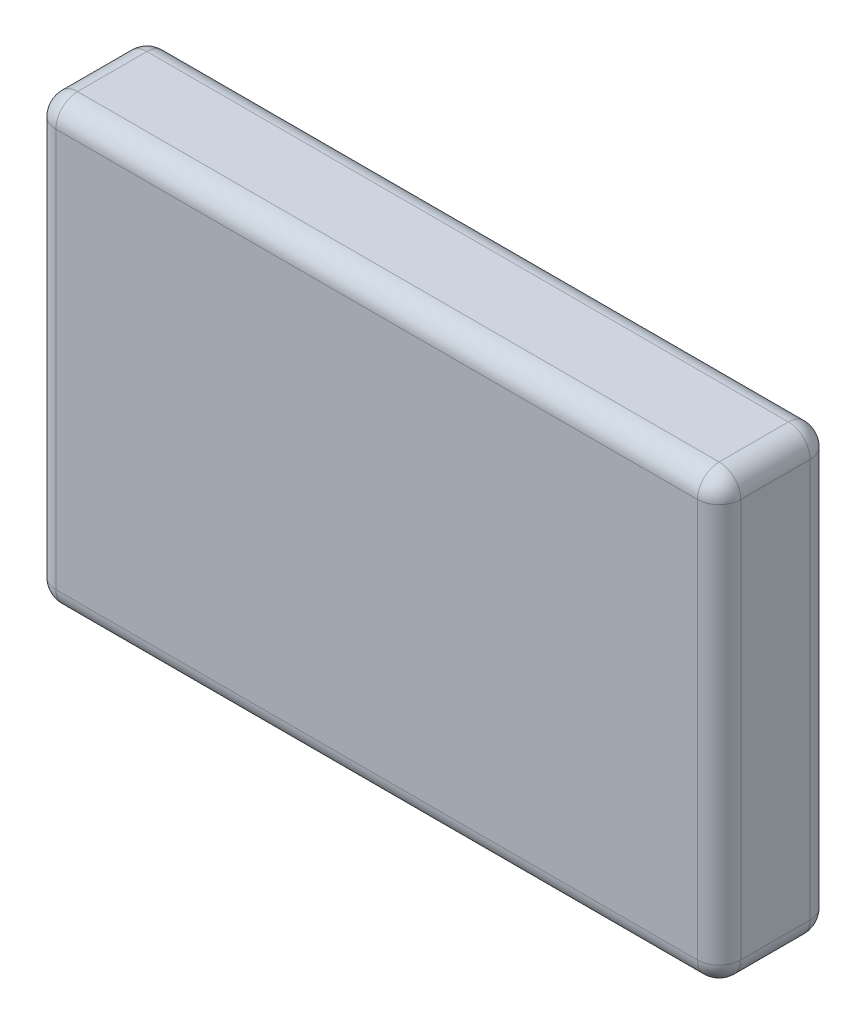
ISO-10303-21;
HEADER;
FILE_DESCRIPTION(('STEP AP214'),'2;1');
FILE_NAME('part.step','',(''),(''),'','','');
FILE_SCHEMA(('AUTOMOTIVE_DESIGN { 1 0 10303 214 1 1 1 1 }'));
ENDSEC;
DATA;
#1=APPLICATION_CONTEXT('core data for automotive mechanical design processes');
#2=APPLICATION_PROTOCOL_DEFINITION('international standard','automotive_design',2000,#1);
#3=PRODUCT_CONTEXT('',#1,'mechanical');
#4=PRODUCT('Part','Part','',(#3));
#5=PRODUCT_RELATED_PRODUCT_CATEGORY('part','',(#4));
#6=PRODUCT_DEFINITION_FORMATION('','',#4);
#7=PRODUCT_DEFINITION_CONTEXT('part definition',#1,'design');
#8=PRODUCT_DEFINITION('design','',#6,#7);
#9=PRODUCT_DEFINITION_SHAPE('','',#8);
#10=(LENGTH_UNIT() NAMED_UNIT(*) SI_UNIT(.MILLI.,.METRE.));
#11=(NAMED_UNIT(*) PLANE_ANGLE_UNIT() SI_UNIT($,.RADIAN.));
#12=(NAMED_UNIT(*) SI_UNIT($,.STERADIAN.) SOLID_ANGLE_UNIT());
#13=UNCERTAINTY_MEASURE_WITH_UNIT(LENGTH_MEASURE(1.E-05),#10,'distance_accuracy_value','');
#14=(GEOMETRIC_REPRESENTATION_CONTEXT(3) GLOBAL_UNCERTAINTY_ASSIGNED_CONTEXT((#13)) GLOBAL_UNIT_ASSIGNED_CONTEXT((#10,
#11,#12)) REPRESENTATION_CONTEXT('',''));
#15=CARTESIAN_POINT('',(0.,0.,0.));
#16=DIRECTION('',(0.,0.,1.));
#17=DIRECTION('',(1.,0.,0.));
#18=AXIS2_PLACEMENT_3D('',#15,#16,#17);
#19=CARTESIAN_POINT('',(0.,0.,26.));
#20=DIRECTION('',(-1.,0.,0.));
#21=DIRECTION('',(0.,0.,1.));
#22=AXIS2_PLACEMENT_3D('',#19,#20,#21);
#23=PLANE('',#22);
#24=DIRECTION('',(0.,1.,0.));
#25=VECTOR('',#24,1.);
#26=CARTESIAN_POINT('',(0.,0.,21.));
#27=LINE('',#26,#25);
#28=CARTESIAN_POINT('',(0.,97.,21.));
#29=VERTEX_POINT('',#28);
#30=CARTESIAN_POINT('',(0.,5.,21.));
#31=VERTEX_POINT('',#30);
#32=EDGE_CURVE('E179',#29,#31,#27,.F.);
#33=ORIENTED_EDGE('',*,*,#32,.T.);
#34=DIRECTION('',(0.,0.,-1.));
#35=VECTOR('',#34,1.);
#36=CARTESIAN_POINT('',(0.,5.,26.));
#37=LINE('',#36,#35);
#38=CARTESIAN_POINT('',(0.,5.,5.));
#39=VERTEX_POINT('',#38);
#40=EDGE_CURVE('E181',#31,#39,#37,.T.);
#41=ORIENTED_EDGE('',*,*,#40,.T.);
#42=DIRECTION('',(0.,1.,0.));
#43=VECTOR('',#42,1.);
#44=CARTESIAN_POINT('',(0.,0.,5.));
#45=LINE('',#44,#43);
#46=CARTESIAN_POINT('',(0.,97.,5.));
#47=VERTEX_POINT('',#46);
#48=EDGE_CURVE('E175',#39,#47,#45,.T.);
#49=ORIENTED_EDGE('',*,*,#48,.T.);
#50=DIRECTION('',(0.,0.,-1.));
#51=VECTOR('',#50,1.);
#52=CARTESIAN_POINT('',(0.,97.,26.));
#53=LINE('',#52,#51);
#54=EDGE_CURVE('E177',#47,#29,#53,.F.);
#55=ORIENTED_EDGE('',*,*,#54,.T.);
#56=EDGE_LOOP('',(#33,#41,#49,#55));
#57=FACE_BOUND('',#56,.T.);
#58=ADVANCED_FACE('F33',(#57),#23,.F.);
#59=CARTESIAN_POINT('',(0.,102.,26.));
#60=DIRECTION('',(0.,-1.,0.));
#61=DIRECTION('',(1.,0.,0.));
#62=AXIS2_PLACEMENT_3D('',#59,#60,#61);
#63=PLANE('',#62);
#64=DIRECTION('',(-1.,0.,0.));
#65=VECTOR('',#64,1.);
#66=CARTESIAN_POINT('',(0.,102.,5.));
#67=LINE('',#66,#65);
#68=CARTESIAN_POINT('',(-5.,102.,5.));
#69=VERTEX_POINT('',#68);
#70=CARTESIAN_POINT('',(-153.,102.,5.));
#71=VERTEX_POINT('',#70);
#72=EDGE_CURVE('E155',#69,#71,#67,.T.);
#73=ORIENTED_EDGE('',*,*,#72,.T.);
#74=DIRECTION('',(0.,0.,-1.));
#75=VECTOR('',#74,1.);
#76=CARTESIAN_POINT('',(-153.,102.,26.));
#77=LINE('',#76,#75);
#78=CARTESIAN_POINT('',(-153.,102.,21.));
#79=VERTEX_POINT('',#78);
#80=EDGE_CURVE('E128',#71,#79,#77,.F.);
#81=ORIENTED_EDGE('',*,*,#80,.T.);
#82=DIRECTION('',(-1.,0.,0.));
#83=VECTOR('',#82,1.);
#84=CARTESIAN_POINT('',(0.,102.,21.));
#85=LINE('',#84,#83);
#86=CARTESIAN_POINT('',(-5.,102.,21.));
#87=VERTEX_POINT('',#86);
#88=EDGE_CURVE('E163',#79,#87,#85,.F.);
#89=ORIENTED_EDGE('',*,*,#88,.T.);
#90=DIRECTION('',(0.,0.,-1.));
#91=VECTOR('',#90,1.);
#92=CARTESIAN_POINT('',(-5.,102.,26.));
#93=LINE('',#92,#91);
#94=EDGE_CURVE('E157',#87,#69,#93,.T.);
#95=ORIENTED_EDGE('',*,*,#94,.T.);
#96=EDGE_LOOP('',(#73,#81,#89,#95));
#97=FACE_BOUND('',#96,.T.);
#98=ADVANCED_FACE('F308',(#97),#63,.F.);
#99=CARTESIAN_POINT('',(-158.,0.,26.));
#100=DIRECTION('',(1.,0.,0.));
#101=DIRECTION('',(0.,0.,-1.));
#102=AXIS2_PLACEMENT_3D('',#99,#100,#101);
#103=PLANE('',#102);
#104=DIRECTION('',(0.,-1.,0.));
#105=VECTOR('',#104,1.);
#106=CARTESIAN_POINT('',(-158.,102.,21.));
#107=LINE('',#106,#105);
#108=CARTESIAN_POINT('',(-158.,4.99999999999997,21.));
#109=VERTEX_POINT('',#108);
#110=CARTESIAN_POINT('',(-158.,97.,21.));
#111=VERTEX_POINT('',#110);
#112=EDGE_CURVE('E153',#109,#111,#107,.F.);
#113=ORIENTED_EDGE('',*,*,#112,.T.);
#114=DIRECTION('',(0.,0.,-1.));
#115=VECTOR('',#114,1.);
#116=CARTESIAN_POINT('',(-158.,97.,26.));
#117=LINE('',#116,#115);
#118=CARTESIAN_POINT('',(-158.,97.,5.));
#119=VERTEX_POINT('',#118);
#120=EDGE_CURVE('E126',#111,#119,#117,.T.);
#121=ORIENTED_EDGE('',*,*,#120,.T.);
#122=DIRECTION('',(0.,-1.,0.));
#123=VECTOR('',#122,1.);
#124=CARTESIAN_POINT('',(-158.,0.,5.));
#125=LINE('',#124,#123);
#126=CARTESIAN_POINT('',(-158.,4.99999999999997,5.));
#127=VERTEX_POINT('',#126);
#128=EDGE_CURVE('E143',#119,#127,#125,.T.);
#129=ORIENTED_EDGE('',*,*,#128,.T.);
#130=DIRECTION('',(0.,0.,-1.));
#131=VECTOR('',#130,1.);
#132=CARTESIAN_POINT('',(-158.,4.99999999999997,26.));
#133=LINE('',#132,#131);
#134=EDGE_CURVE('E149',#127,#109,#133,.F.);
#135=ORIENTED_EDGE('',*,*,#134,.T.);
#136=EDGE_LOOP('',(#113,#121,#129,#135));
#137=FACE_BOUND('',#136,.T.);
#138=ADVANCED_FACE('F151',(#137),#103,.F.);
#139=CARTESIAN_POINT('',(0.,0.,26.));
#140=DIRECTION('',(0.,1.,0.));
#141=DIRECTION('',(-1.,0.,0.));
#142=AXIS2_PLACEMENT_3D('',#139,#140,#141);
#143=PLANE('',#142);
#144=DIRECTION('',(1.,0.,0.));
#145=VECTOR('',#144,1.);
#146=CARTESIAN_POINT('',(0.,0.,5.));
#147=LINE('',#146,#145);
#148=CARTESIAN_POINT('',(-153.,0.,5.));
#149=VERTEX_POINT('',#148);
#150=CARTESIAN_POINT('',(-5.,0.,5.));
#151=VERTEX_POINT('',#150);
#152=EDGE_CURVE('E184',#149,#151,#147,.T.);
#153=ORIENTED_EDGE('',*,*,#152,.T.);
#154=DIRECTION('',(0.,0.,-1.));
#155=VECTOR('',#154,1.);
#156=CARTESIAN_POINT('',(-5.,0.,26.));
#157=LINE('',#156,#155);
#158=CARTESIAN_POINT('',(-5.,0.,21.));
#159=VERTEX_POINT('',#158);
#160=EDGE_CURVE('E190',#151,#159,#157,.F.);
#161=ORIENTED_EDGE('',*,*,#160,.T.);
#162=DIRECTION('',(1.,0.,0.));
#163=VECTOR('',#162,1.);
#164=CARTESIAN_POINT('',(-158.,0.,21.));
#165=LINE('',#164,#163);
#166=CARTESIAN_POINT('',(-153.,0.,21.));
#167=VERTEX_POINT('',#166);
#168=EDGE_CURVE('E188',#159,#167,#165,.F.);
#169=ORIENTED_EDGE('',*,*,#168,.T.);
#170=DIRECTION('',(0.,0.,-1.));
#171=VECTOR('',#170,1.);
#172=CARTESIAN_POINT('',(-153.,0.,26.));
#173=LINE('',#172,#171);
#174=EDGE_CURVE('E186',#167,#149,#173,.T.);
#175=ORIENTED_EDGE('',*,*,#174,.T.);
#176=EDGE_LOOP('',(#153,#161,#169,#175));
#177=FACE_BOUND('',#176,.T.);
#178=ADVANCED_FACE('F280',(#177),#143,.F.);
#179=CARTESIAN_POINT('',(0.,0.,26.));
#180=DIRECTION('',(0.,0.,1.));
#181=DIRECTION('',(1.,0.,0.));
#182=AXIS2_PLACEMENT_3D('',#179,#180,#181);
#183=PLANE('',#182);
#184=DIRECTION('',(0.,1.,0.));
#185=VECTOR('',#184,1.);
#186=CARTESIAN_POINT('',(-5.,102.,26.));
#187=LINE('',#186,#185);
#188=CARTESIAN_POINT('',(-5.,5.,26.));
#189=VERTEX_POINT('',#188);
#190=CARTESIAN_POINT('',(-5.,97.,26.));
#191=VERTEX_POINT('',#190);
#192=EDGE_CURVE('E170',#189,#191,#187,.T.);
#193=ORIENTED_EDGE('',*,*,#192,.T.);
#194=DIRECTION('',(-1.,0.,0.));
#195=VECTOR('',#194,1.);
#196=CARTESIAN_POINT('',(-158.,97.,26.));
#197=LINE('',#196,#195);
#198=CARTESIAN_POINT('',(-153.,97.,26.));
#199=VERTEX_POINT('',#198);
#200=EDGE_CURVE('E172',#191,#199,#197,.T.);
#201=ORIENTED_EDGE('',*,*,#200,.T.);
#202=DIRECTION('',(0.,-1.,0.));
#203=VECTOR('',#202,1.);
#204=CARTESIAN_POINT('',(-153.,0.,26.));
#205=LINE('',#204,#203);
#206=CARTESIAN_POINT('',(-153.,4.99999999999997,26.));
#207=VERTEX_POINT('',#206);
#208=EDGE_CURVE('E168',#199,#207,#205,.T.);
#209=ORIENTED_EDGE('',*,*,#208,.T.);
#210=DIRECTION('',(1.,0.,0.));
#211=VECTOR('',#210,1.);
#212=CARTESIAN_POINT('',(0.,5.,26.));
#213=LINE('',#212,#211);
#214=EDGE_CURVE('E166',#207,#189,#213,.T.);
#215=ORIENTED_EDGE('',*,*,#214,.T.);
#216=EDGE_LOOP('',(#193,#201,#209,#215));
#217=FACE_BOUND('',#216,.T.);
#218=ADVANCED_FACE('F271',(#217),#183,.T.);
#219=CARTESIAN_POINT('',(0.,0.,0.));
#220=DIRECTION('',(0.,0.,1.));
#221=DIRECTION('',(1.,0.,0.));
#222=AXIS2_PLACEMENT_3D('',#219,#220,#221);
#223=PLANE('',#222);
#224=DIRECTION('',(-1.,0.,0.));
#225=VECTOR('',#224,1.);
#226=CARTESIAN_POINT('',(0.,97.,0.));
#227=LINE('',#226,#225);
#228=CARTESIAN_POINT('',(-153.,97.,0.));
#229=VERTEX_POINT('',#228);
#230=CARTESIAN_POINT('',(-5.,97.,0.));
#231=VERTEX_POINT('',#230);
#232=EDGE_CURVE('E42',#229,#231,#227,.F.);
#233=ORIENTED_EDGE('',*,*,#232,.T.);
#234=DIRECTION('',(0.,1.,0.));
#235=VECTOR('',#234,1.);
#236=CARTESIAN_POINT('',(-5.,0.,0.));
#237=LINE('',#236,#235);
#238=CARTESIAN_POINT('',(-5.,5.,0.));
#239=VERTEX_POINT('',#238);
#240=EDGE_CURVE('E11',#231,#239,#237,.F.);
#241=ORIENTED_EDGE('',*,*,#240,.T.);
#242=DIRECTION('',(1.,0.,0.));
#243=VECTOR('',#242,1.);
#244=CARTESIAN_POINT('',(0.,5.,0.));
#245=LINE('',#244,#243);
#246=CARTESIAN_POINT('',(-153.,4.99999999999997,0.));
#247=VERTEX_POINT('',#246);
#248=EDGE_CURVE('E193',#239,#247,#245,.F.);
#249=ORIENTED_EDGE('',*,*,#248,.T.);
#250=DIRECTION('',(0.,-1.,0.));
#251=VECTOR('',#250,1.);
#252=CARTESIAN_POINT('',(-153.,0.,0.));
#253=LINE('',#252,#251);
#254=EDGE_CURVE('E53',#247,#229,#253,.F.);
#255=ORIENTED_EDGE('',*,*,#254,.T.);
#256=EDGE_LOOP('',(#233,#241,#249,#255));
#257=FACE_BOUND('',#256,.T.);
#258=ADVANCED_FACE('F478',(#257),#223,.F.);
#259=CARTESIAN_POINT('',(-5.,5.,26.));
#260=DIRECTION('',(0.,0.,-1.));
#261=DIRECTION('',(-1.,0.,0.));
#262=AXIS2_PLACEMENT_3D('',#259,#260,#261);
#263=CYLINDRICAL_SURFACE('',#262,5.);
#264=CARTESIAN_POINT('',(-5.,5.,21.));
#265=DIRECTION('',(0.,0.,1.));
#266=DIRECTION('',(1.,0.,0.));
#267=AXIS2_PLACEMENT_3D('',#264,#265,#266);
#268=CIRCLE('',#267,5.);
#269=EDGE_CURVE('E37',#159,#31,#268,.T.);
#270=ORIENTED_EDGE('',*,*,#269,.F.);
#271=ORIENTED_EDGE('',*,*,#160,.F.);
#272=CARTESIAN_POINT('',(-5.,5.,5.));
#273=DIRECTION('',(0.,0.,-1.));
#274=DIRECTION('',(-1.,0.,0.));
#275=AXIS2_PLACEMENT_3D('',#272,#273,#274);
#276=CIRCLE('',#275,5.);
#277=EDGE_CURVE('E248',#39,#151,#276,.T.);
#278=ORIENTED_EDGE('',*,*,#277,.F.);
#279=ORIENTED_EDGE('',*,*,#40,.F.);
#280=EDGE_LOOP('',(#270,#271,#278,#279));
#281=FACE_BOUND('',#280,.T.);
#282=ADVANCED_FACE('F35',(#281),#263,.T.);
#283=CARTESIAN_POINT('',(-5.,5.,21.));
#284=DIRECTION('',(0.,0.,1.));
#285=DIRECTION('',(1.,0.,0.));
#286=AXIS2_PLACEMENT_3D('',#283,#284,#285);
#287=SPHERICAL_SURFACE('',#286,5.);
#288=CARTESIAN_POINT('',(-5.,5.,21.));
#289=DIRECTION('',(1.,0.,0.));
#290=DIRECTION('',(0.,1.,0.));
#291=AXIS2_PLACEMENT_3D('',#288,#289,#290);
#292=CIRCLE('',#291,5.);
#293=EDGE_CURVE('E243',#159,#189,#292,.F.);
#294=ORIENTED_EDGE('',*,*,#293,.F.);
#295=ORIENTED_EDGE('',*,*,#269,.T.);
#296=CARTESIAN_POINT('',(-5.,5.,21.));
#297=DIRECTION('',(0.,-1.,0.));
#298=DIRECTION('',(0.,0.,-1.));
#299=AXIS2_PLACEMENT_3D('',#296,#297,#298);
#300=CIRCLE('',#299,5.);
#301=EDGE_CURVE('E246',#189,#31,#300,.F.);
#302=ORIENTED_EDGE('',*,*,#301,.F.);
#303=EDGE_LOOP('',(#294,#295,#302));
#304=FACE_BOUND('',#303,.T.);
#305=ADVANCED_FACE('F259',(#304),#287,.T.);
#306=CARTESIAN_POINT('',(-5.,5.,5.));
#307=DIRECTION('',(0.,0.,1.));
#308=DIRECTION('',(1.,0.,0.));
#309=AXIS2_PLACEMENT_3D('',#306,#307,#308);
#310=SPHERICAL_SURFACE('',#309,5.);
#311=CARTESIAN_POINT('',(-5.,5.,5.));
#312=DIRECTION('',(0.,-1.,0.));
#313=DIRECTION('',(1.,0.,0.));
#314=AXIS2_PLACEMENT_3D('',#311,#312,#313);
#315=CIRCLE('',#314,5.);
#316=EDGE_CURVE('E237',#39,#239,#315,.F.);
#317=ORIENTED_EDGE('',*,*,#316,.F.);
#318=ORIENTED_EDGE('',*,*,#277,.T.);
#319=CARTESIAN_POINT('',(-5.,5.,5.));
#320=DIRECTION('',(1.,0.,0.));
#321=DIRECTION('',(0.,1.,0.));
#322=AXIS2_PLACEMENT_3D('',#319,#320,#321);
#323=CIRCLE('',#322,5.);
#324=EDGE_CURVE('E240',#239,#151,#323,.F.);
#325=ORIENTED_EDGE('',*,*,#324,.F.);
#326=EDGE_LOOP('',(#317,#318,#325));
#327=FACE_BOUND('',#326,.T.);
#328=ADVANCED_FACE('F457',(#327),#310,.T.);
#329=CARTESIAN_POINT('',(-5.,0.,21.));
#330=DIRECTION('',(0.,-1.,0.));
#331=DIRECTION('',(0.,0.,-1.));
#332=AXIS2_PLACEMENT_3D('',#329,#330,#331);
#333=CYLINDRICAL_SURFACE('',#332,5.);
#334=ORIENTED_EDGE('',*,*,#301,.T.);
#335=ORIENTED_EDGE('',*,*,#32,.F.);
#336=CARTESIAN_POINT('',(-5.,97.,21.));
#337=DIRECTION('',(0.,1.,0.));
#338=DIRECTION('',(0.,0.,1.));
#339=AXIS2_PLACEMENT_3D('',#336,#337,#338);
#340=CIRCLE('',#339,5.);
#341=EDGE_CURVE('E231',#191,#29,#340,.T.);
#342=ORIENTED_EDGE('',*,*,#341,.F.);
#343=ORIENTED_EDGE('',*,*,#192,.F.);
#344=EDGE_LOOP('',(#334,#335,#342,#343));
#345=FACE_BOUND('',#344,.T.);
#346=ADVANCED_FACE('F266',(#345),#333,.T.);
#347=CARTESIAN_POINT('',(0.,5.,21.));
#348=DIRECTION('',(-1.,0.,0.));
#349=DIRECTION('',(0.,-1.,0.));
#350=AXIS2_PLACEMENT_3D('',#347,#348,#349);
#351=CYLINDRICAL_SURFACE('',#350,5.);
#352=ORIENTED_EDGE('',*,*,#293,.T.);
#353=ORIENTED_EDGE('',*,*,#214,.F.);
#354=CARTESIAN_POINT('',(-153.,4.99999999999997,21.));
#355=DIRECTION('',(-1.,0.,0.));
#356=DIRECTION('',(0.,0.,1.));
#357=AXIS2_PLACEMENT_3D('',#354,#355,#356);
#358=CIRCLE('',#357,5.);
#359=EDGE_CURVE('E228',#167,#207,#358,.T.);
#360=ORIENTED_EDGE('',*,*,#359,.F.);
#361=ORIENTED_EDGE('',*,*,#168,.F.);
#362=EDGE_LOOP('',(#352,#353,#360,#361));
#363=FACE_BOUND('',#362,.T.);
#364=ADVANCED_FACE('F277',(#363),#351,.T.);
#365=CARTESIAN_POINT('',(-153.,4.99999999999997,26.));
#366=DIRECTION('',(0.,0.,-1.));
#367=DIRECTION('',(-1.,0.,0.));
#368=AXIS2_PLACEMENT_3D('',#365,#366,#367);
#369=CYLINDRICAL_SURFACE('',#368,5.);
#370=CARTESIAN_POINT('',(-153.,4.99999999999997,5.));
#371=DIRECTION('',(0.,0.,-1.));
#372=DIRECTION('',(-1.,0.,0.));
#373=AXIS2_PLACEMENT_3D('',#370,#371,#372);
#374=CIRCLE('',#373,5.);
#375=EDGE_CURVE('E222',#149,#127,#374,.T.);
#376=ORIENTED_EDGE('',*,*,#375,.F.);
#377=ORIENTED_EDGE('',*,*,#174,.F.);
#378=CARTESIAN_POINT('',(-153.,4.99999999999997,21.));
#379=DIRECTION('',(0.,0.,1.));
#380=DIRECTION('',(1.,0.,0.));
#381=AXIS2_PLACEMENT_3D('',#378,#379,#380);
#382=CIRCLE('',#381,5.);
#383=EDGE_CURVE('E225',#109,#167,#382,.T.);
#384=ORIENTED_EDGE('',*,*,#383,.F.);
#385=ORIENTED_EDGE('',*,*,#134,.F.);
#386=EDGE_LOOP('',(#376,#377,#384,#385));
#387=FACE_BOUND('',#386,.T.);
#388=ADVANCED_FACE('F285',(#387),#369,.T.);
#389=CARTESIAN_POINT('',(0.,5.,5.));
#390=DIRECTION('',(1.,0.,0.));
#391=DIRECTION('',(0.,1.,0.));
#392=AXIS2_PLACEMENT_3D('',#389,#390,#391);
#393=CYLINDRICAL_SURFACE('',#392,5.);
#394=ORIENTED_EDGE('',*,*,#324,.T.);
#395=ORIENTED_EDGE('',*,*,#152,.F.);
#396=CARTESIAN_POINT('',(-153.,4.99999999999997,5.));
#397=DIRECTION('',(-1.,0.,0.));
#398=DIRECTION('',(0.,-1.,0.));
#399=AXIS2_PLACEMENT_3D('',#396,#397,#398);
#400=CIRCLE('',#399,5.);
#401=EDGE_CURVE('E219',#247,#149,#400,.T.);
#402=ORIENTED_EDGE('',*,*,#401,.F.);
#403=ORIENTED_EDGE('',*,*,#248,.F.);
#404=EDGE_LOOP('',(#394,#395,#402,#403));
#405=FACE_BOUND('',#404,.T.);
#406=ADVANCED_FACE('F291',(#405),#393,.T.);
#407=CARTESIAN_POINT('',(-5.,0.,5.));
#408=DIRECTION('',(0.,1.,0.));
#409=DIRECTION('',(0.,0.,1.));
#410=AXIS2_PLACEMENT_3D('',#407,#408,#409);
#411=CYLINDRICAL_SURFACE('',#410,5.);
#412=ORIENTED_EDGE('',*,*,#316,.T.);
#413=ORIENTED_EDGE('',*,*,#240,.F.);
#414=CARTESIAN_POINT('',(-5.,97.,5.));
#415=DIRECTION('',(0.,1.,0.));
#416=DIRECTION('',(0.,0.,1.));
#417=AXIS2_PLACEMENT_3D('',#414,#415,#416);
#418=CIRCLE('',#417,5.);
#419=EDGE_CURVE('E216',#47,#231,#418,.T.);
#420=ORIENTED_EDGE('',*,*,#419,.F.);
#421=ORIENTED_EDGE('',*,*,#48,.F.);
#422=EDGE_LOOP('',(#412,#413,#420,#421));
#423=FACE_BOUND('',#422,.T.);
#424=ADVANCED_FACE('F301',(#423),#411,.T.);
#425=CARTESIAN_POINT('',(-5.,97.,26.));
#426=DIRECTION('',(0.,0.,-1.));
#427=DIRECTION('',(-1.,0.,0.));
#428=AXIS2_PLACEMENT_3D('',#425,#426,#427);
#429=CYLINDRICAL_SURFACE('',#428,5.);
#430=CARTESIAN_POINT('',(-5.,97.,21.));
#431=DIRECTION('',(0.,0.,1.));
#432=DIRECTION('',(1.,0.,0.));
#433=AXIS2_PLACEMENT_3D('',#430,#431,#432);
#434=CIRCLE('',#433,5.);
#435=EDGE_CURVE('E234',#29,#87,#434,.T.);
#436=ORIENTED_EDGE('',*,*,#435,.F.);
#437=ORIENTED_EDGE('',*,*,#54,.F.);
#438=CARTESIAN_POINT('',(-5.,97.,5.));
#439=DIRECTION('',(0.,0.,-1.));
#440=DIRECTION('',(-1.,0.,0.));
#441=AXIS2_PLACEMENT_3D('',#438,#439,#440);
#442=CIRCLE('',#441,5.);
#443=EDGE_CURVE('E213',#69,#47,#442,.T.);
#444=ORIENTED_EDGE('',*,*,#443,.F.);
#445=ORIENTED_EDGE('',*,*,#94,.F.);
#446=EDGE_LOOP('',(#436,#437,#444,#445));
#447=FACE_BOUND('',#446,.T.);
#448=ADVANCED_FACE('F297',(#447),#429,.T.);
#449=CARTESIAN_POINT('',(-5.,97.,21.));
#450=DIRECTION('',(0.,0.,1.));
#451=DIRECTION('',(1.,0.,0.));
#452=AXIS2_PLACEMENT_3D('',#449,#450,#451);
#453=SPHERICAL_SURFACE('',#452,5.);
#454=ORIENTED_EDGE('',*,*,#341,.T.);
#455=ORIENTED_EDGE('',*,*,#435,.T.);
#456=CARTESIAN_POINT('',(-5.,97.,21.));
#457=DIRECTION('',(1.,0.,0.));
#458=DIRECTION('',(0.,0.,-1.));
#459=AXIS2_PLACEMENT_3D('',#456,#457,#458);
#460=CIRCLE('',#459,5.);
#461=EDGE_CURVE('E210',#191,#87,#460,.F.);
#462=ORIENTED_EDGE('',*,*,#461,.F.);
#463=EDGE_LOOP('',(#454,#455,#462));
#464=FACE_BOUND('',#463,.T.);
#465=ADVANCED_FACE('F311',(#464),#453,.T.);
#466=CARTESIAN_POINT('',(-153.,4.99999999999997,21.));
#467=DIRECTION('',(0.,0.,1.));
#468=DIRECTION('',(1.,0.,0.));
#469=AXIS2_PLACEMENT_3D('',#466,#467,#468);
#470=SPHERICAL_SURFACE('',#469,5.);
#471=ORIENTED_EDGE('',*,*,#383,.T.);
#472=ORIENTED_EDGE('',*,*,#359,.T.);
#473=CARTESIAN_POINT('',(-153.,4.99999999999997,21.));
#474=DIRECTION('',(0.,-1.,0.));
#475=DIRECTION('',(0.,0.,-1.));
#476=AXIS2_PLACEMENT_3D('',#473,#474,#475);
#477=CIRCLE('',#476,5.);
#478=EDGE_CURVE('E207',#109,#207,#477,.F.);
#479=ORIENTED_EDGE('',*,*,#478,.F.);
#480=EDGE_LOOP('',(#471,#472,#479));
#481=FACE_BOUND('',#480,.T.);
#482=ADVANCED_FACE('F320',(#481),#470,.T.);
#483=CARTESIAN_POINT('',(-153.,4.99999999999997,5.));
#484=DIRECTION('',(0.,0.,1.));
#485=DIRECTION('',(1.,0.,0.));
#486=AXIS2_PLACEMENT_3D('',#483,#484,#485);
#487=SPHERICAL_SURFACE('',#486,5.);
#488=ORIENTED_EDGE('',*,*,#401,.T.);
#489=ORIENTED_EDGE('',*,*,#375,.T.);
#490=CARTESIAN_POINT('',(-153.,4.99999999999997,5.));
#491=DIRECTION('',(0.,-1.,0.));
#492=DIRECTION('',(0.,0.,-1.));
#493=AXIS2_PLACEMENT_3D('',#490,#491,#492);
#494=CIRCLE('',#493,5.);
#495=EDGE_CURVE('E146',#247,#127,#494,.F.);
#496=ORIENTED_EDGE('',*,*,#495,.F.);
#497=EDGE_LOOP('',(#488,#489,#496));
#498=FACE_BOUND('',#497,.T.);
#499=ADVANCED_FACE('F289',(#498),#487,.T.);
#500=CARTESIAN_POINT('',(-5.,97.,5.));
#501=DIRECTION('',(0.,0.,1.));
#502=DIRECTION('',(1.,0.,0.));
#503=AXIS2_PLACEMENT_3D('',#500,#501,#502);
#504=SPHERICAL_SURFACE('',#503,5.);
#505=ORIENTED_EDGE('',*,*,#443,.T.);
#506=ORIENTED_EDGE('',*,*,#419,.T.);
#507=CARTESIAN_POINT('',(-5.,97.,5.));
#508=DIRECTION('',(1.,0.,0.));
#509=DIRECTION('',(0.,0.,-1.));
#510=AXIS2_PLACEMENT_3D('',#507,#508,#509);
#511=CIRCLE('',#510,5.);
#512=EDGE_CURVE('E203',#69,#231,#511,.F.);
#513=ORIENTED_EDGE('',*,*,#512,.F.);
#514=EDGE_LOOP('',(#505,#506,#513));
#515=FACE_BOUND('',#514,.T.);
#516=ADVANCED_FACE('F303',(#515),#504,.T.);
#517=CARTESIAN_POINT('',(0.,97.,21.));
#518=DIRECTION('',(1.,0.,0.));
#519=DIRECTION('',(0.,1.,0.));
#520=AXIS2_PLACEMENT_3D('',#517,#518,#519);
#521=CYLINDRICAL_SURFACE('',#520,5.);
#522=ORIENTED_EDGE('',*,*,#461,.T.);
#523=ORIENTED_EDGE('',*,*,#88,.F.);
#524=CARTESIAN_POINT('',(-153.,97.,21.));
#525=DIRECTION('',(-1.,0.,0.));
#526=DIRECTION('',(0.,0.,1.));
#527=AXIS2_PLACEMENT_3D('',#524,#525,#526);
#528=CIRCLE('',#527,5.);
#529=EDGE_CURVE('E200',#199,#79,#528,.T.);
#530=ORIENTED_EDGE('',*,*,#529,.F.);
#531=ORIENTED_EDGE('',*,*,#200,.F.);
#532=EDGE_LOOP('',(#522,#523,#530,#531));
#533=FACE_BOUND('',#532,.T.);
#534=ADVANCED_FACE('F313',(#533),#521,.T.);
#535=CARTESIAN_POINT('',(-153.,0.,21.));
#536=DIRECTION('',(0.,1.,0.));
#537=DIRECTION('',(0.,0.,1.));
#538=AXIS2_PLACEMENT_3D('',#535,#536,#537);
#539=CYLINDRICAL_SURFACE('',#538,5.);
#540=ORIENTED_EDGE('',*,*,#478,.T.);
#541=ORIENTED_EDGE('',*,*,#208,.F.);
#542=CARTESIAN_POINT('',(-153.,97.,21.));
#543=DIRECTION('',(0.,1.,0.));
#544=DIRECTION('',(0.,0.,1.));
#545=AXIS2_PLACEMENT_3D('',#542,#543,#544);
#546=CIRCLE('',#545,5.);
#547=EDGE_CURVE('E140',#111,#199,#546,.T.);
#548=ORIENTED_EDGE('',*,*,#547,.F.);
#549=ORIENTED_EDGE('',*,*,#112,.F.);
#550=EDGE_LOOP('',(#540,#541,#548,#549));
#551=FACE_BOUND('',#550,.T.);
#552=ADVANCED_FACE('F318',(#551),#539,.T.);
#553=CARTESIAN_POINT('',(-153.,0.,5.));
#554=DIRECTION('',(0.,-1.,0.));
#555=DIRECTION('',(0.,0.,-1.));
#556=AXIS2_PLACEMENT_3D('',#553,#554,#555);
#557=CYLINDRICAL_SURFACE('',#556,5.);
#558=ORIENTED_EDGE('',*,*,#495,.T.);
#559=ORIENTED_EDGE('',*,*,#128,.F.);
#560=CARTESIAN_POINT('',(-153.,97.,5.));
#561=DIRECTION('',(0.,1.,0.));
#562=DIRECTION('',(0.,0.,1.));
#563=AXIS2_PLACEMENT_3D('',#560,#561,#562);
#564=CIRCLE('',#563,5.);
#565=EDGE_CURVE('E134',#229,#119,#564,.T.);
#566=ORIENTED_EDGE('',*,*,#565,.F.);
#567=ORIENTED_EDGE('',*,*,#254,.F.);
#568=EDGE_LOOP('',(#558,#559,#566,#567));
#569=FACE_BOUND('',#568,.T.);
#570=ADVANCED_FACE('F144',(#569),#557,.T.);
#571=CARTESIAN_POINT('',(0.,97.,5.));
#572=DIRECTION('',(-1.,0.,0.));
#573=DIRECTION('',(0.,-1.,0.));
#574=AXIS2_PLACEMENT_3D('',#571,#572,#573);
#575=CYLINDRICAL_SURFACE('',#574,5.);
#576=ORIENTED_EDGE('',*,*,#512,.T.);
#577=ORIENTED_EDGE('',*,*,#232,.F.);
#578=CARTESIAN_POINT('',(-153.,97.,5.));
#579=DIRECTION('',(-1.,0.,0.));
#580=DIRECTION('',(0.,0.,1.));
#581=AXIS2_PLACEMENT_3D('',#578,#579,#580);
#582=CIRCLE('',#581,5.);
#583=EDGE_CURVE('E138',#71,#229,#582,.T.);
#584=ORIENTED_EDGE('',*,*,#583,.F.);
#585=ORIENTED_EDGE('',*,*,#72,.F.);
#586=EDGE_LOOP('',(#576,#577,#584,#585));
#587=FACE_BOUND('',#586,.T.);
#588=ADVANCED_FACE('F306',(#587),#575,.T.);
#589=CARTESIAN_POINT('',(-153.,97.,21.));
#590=DIRECTION('',(0.,0.,1.));
#591=DIRECTION('',(1.,0.,0.));
#592=AXIS2_PLACEMENT_3D('',#589,#590,#591);
#593=SPHERICAL_SURFACE('',#592,5.);
#594=ORIENTED_EDGE('',*,*,#547,.T.);
#595=ORIENTED_EDGE('',*,*,#529,.T.);
#596=CARTESIAN_POINT('',(-153.,97.,21.));
#597=DIRECTION('',(0.,0.,1.));
#598=DIRECTION('',(1.,0.,0.));
#599=AXIS2_PLACEMENT_3D('',#596,#597,#598);
#600=CIRCLE('',#599,5.);
#601=EDGE_CURVE('E131',#111,#79,#600,.F.);
#602=ORIENTED_EDGE('',*,*,#601,.F.);
#603=EDGE_LOOP('',(#594,#595,#602));
#604=FACE_BOUND('',#603,.T.);
#605=ADVANCED_FACE('F341',(#604),#593,.T.);
#606=CARTESIAN_POINT('',(-153.,97.,5.));
#607=DIRECTION('',(0.,0.,1.));
#608=DIRECTION('',(1.,0.,0.));
#609=AXIS2_PLACEMENT_3D('',#606,#607,#608);
#610=SPHERICAL_SURFACE('',#609,5.);
#611=ORIENTED_EDGE('',*,*,#583,.T.);
#612=ORIENTED_EDGE('',*,*,#565,.T.);
#613=CARTESIAN_POINT('',(-153.,97.,5.));
#614=DIRECTION('',(0.,0.,-1.));
#615=DIRECTION('',(-1.,0.,0.));
#616=AXIS2_PLACEMENT_3D('',#613,#614,#615);
#617=CIRCLE('',#616,5.);
#618=EDGE_CURVE('E122',#71,#119,#617,.F.);
#619=ORIENTED_EDGE('',*,*,#618,.F.);
#620=EDGE_LOOP('',(#611,#612,#619));
#621=FACE_BOUND('',#620,.T.);
#622=ADVANCED_FACE('F136',(#621),#610,.T.);
#623=CARTESIAN_POINT('',(-153.,97.,26.));
#624=DIRECTION('',(0.,0.,-1.));
#625=DIRECTION('',(-1.,0.,0.));
#626=AXIS2_PLACEMENT_3D('',#623,#624,#625);
#627=CYLINDRICAL_SURFACE('',#626,5.);
#628=ORIENTED_EDGE('',*,*,#601,.T.);
#629=ORIENTED_EDGE('',*,*,#80,.F.);
#630=ORIENTED_EDGE('',*,*,#618,.T.);
#631=ORIENTED_EDGE('',*,*,#120,.F.);
#632=EDGE_LOOP('',(#628,#629,#630,#631));
#633=FACE_BOUND('',#632,.T.);
#634=ADVANCED_FACE('F124',(#633),#627,.T.);
#635=CLOSED_SHELL('',(#58,#98,#138,#178,#218,#258,#282,#305,#328,#346,#364,#388,#406,#424,#448,
#465,#482,#499,#516,#534,#552,#570,#588,#605,#622,#634));
#636=MANIFOLD_SOLID_BREP('B2',#635);
#637=ADVANCED_BREP_SHAPE_REPRESENTATION('',(#18,#636),#14);
#638=SHAPE_DEFINITION_REPRESENTATION(#9,#637);
ENDSEC;
END-ISO-10303-21;
